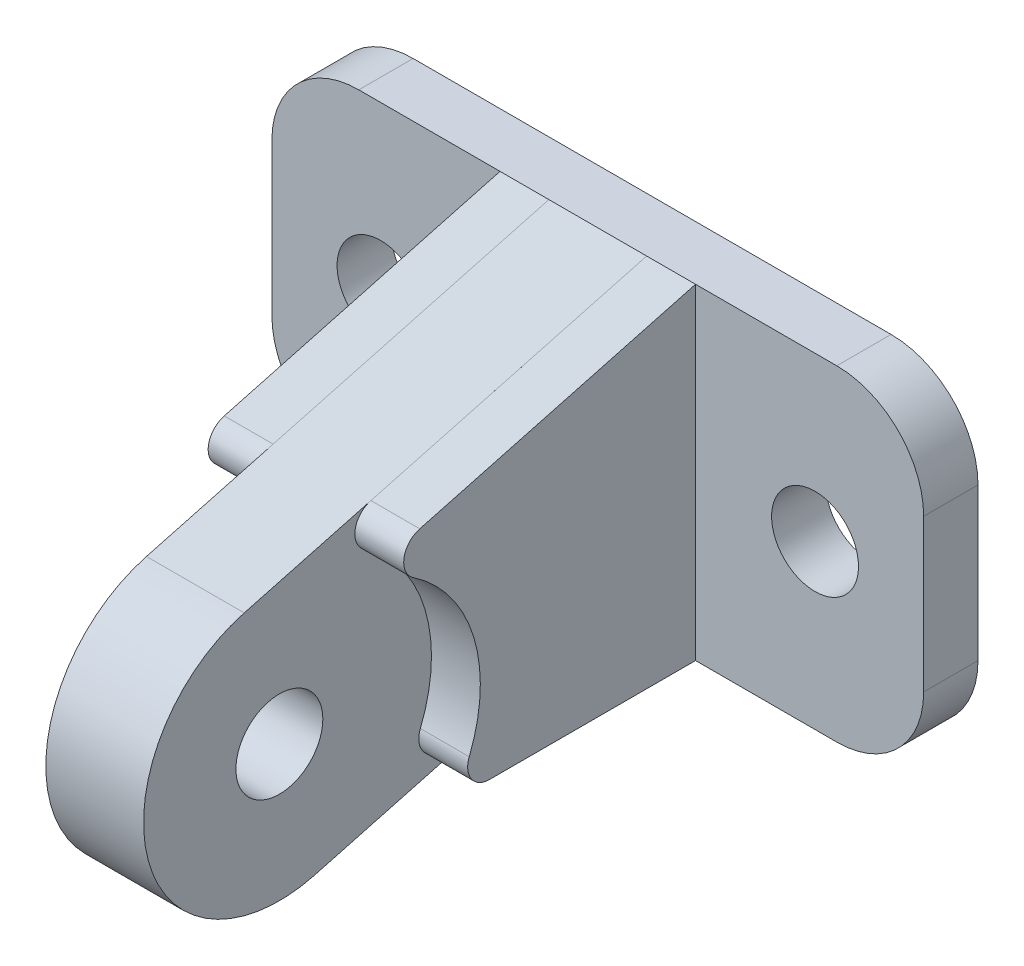
ISO-10303-21;
HEADER;
FILE_DESCRIPTION(('STEP AP214'),'2;1');
FILE_NAME('part.step','',(''),(''),'','','');
FILE_SCHEMA(('AUTOMOTIVE_DESIGN { 1 0 10303 214 1 1 1 1 }'));
ENDSEC;
DATA;
#1=APPLICATION_CONTEXT('core data for automotive mechanical design processes');
#2=APPLICATION_PROTOCOL_DEFINITION('international standard','automotive_design',2000,#1);
#3=PRODUCT_CONTEXT('',#1,'mechanical');
#4=PRODUCT('Part','Part','',(#3));
#5=PRODUCT_RELATED_PRODUCT_CATEGORY('part','',(#4));
#6=PRODUCT_DEFINITION_FORMATION('','',#4);
#7=PRODUCT_DEFINITION_CONTEXT('part definition',#1,'design');
#8=PRODUCT_DEFINITION('design','',#6,#7);
#9=PRODUCT_DEFINITION_SHAPE('','',#8);
#10=(LENGTH_UNIT() NAMED_UNIT(*) SI_UNIT(.MILLI.,.METRE.));
#11=(NAMED_UNIT(*) PLANE_ANGLE_UNIT() SI_UNIT($,.RADIAN.));
#12=(NAMED_UNIT(*) SI_UNIT($,.STERADIAN.) SOLID_ANGLE_UNIT());
#13=UNCERTAINTY_MEASURE_WITH_UNIT(LENGTH_MEASURE(1.E-05),#10,'distance_accuracy_value','');
#14=(GEOMETRIC_REPRESENTATION_CONTEXT(3) GLOBAL_UNCERTAINTY_ASSIGNED_CONTEXT((#13)) GLOBAL_UNIT_ASSIGNED_CONTEXT((#10,
#11,#12)) REPRESENTATION_CONTEXT('',''));
#15=CARTESIAN_POINT('',(0.,0.,0.));
#16=DIRECTION('',(0.,0.,1.));
#17=DIRECTION('',(1.,0.,0.));
#18=AXIS2_PLACEMENT_3D('',#15,#16,#17);
#19=CARTESIAN_POINT('',(0.,-15.,5.));
#20=DIRECTION('',(0.,1.,0.));
#21=DIRECTION('',(0.,0.,1.));
#22=AXIS2_PLACEMENT_3D('',#19,#20,#21);
#23=PLANE('',#22);
#24=DIRECTION('',(0.,0.,1.));
#25=VECTOR('',#24,1.);
#26=CARTESIAN_POINT('',(4.5,-15.,0.));
#27=LINE('',#26,#25);
#28=CARTESIAN_POINT('',(4.5,-15.,20.3718743059186));
#29=VERTEX_POINT('',#28);
#30=CARTESIAN_POINT('',(4.5,-15.,23.9793621856294));
#31=VERTEX_POINT('',#30);
#32=EDGE_CURVE('E442',#29,#31,#27,.T.);
#33=ORIENTED_EDGE('',*,*,#32,.F.);
#34=DIRECTION('',(1.,0.,0.));
#35=VECTOR('',#34,1.);
#36=CARTESIAN_POINT('',(-4.5,-15.,20.3718743059186));
#37=LINE('',#36,#35);
#38=CARTESIAN_POINT('',(-4.5,-15.,20.3718743059186));
#39=VERTEX_POINT('',#38);
#40=EDGE_CURVE('E412',#39,#29,#37,.T.);
#41=ORIENTED_EDGE('',*,*,#40,.F.);
#42=DIRECTION('',(0.,0.,1.));
#43=VECTOR('',#42,1.);
#44=CARTESIAN_POINT('',(-4.5,-15.,0.));
#45=LINE('',#44,#43);
#46=CARTESIAN_POINT('',(-4.5,-15.,23.9793621856294));
#47=VERTEX_POINT('',#46);
#48=EDGE_CURVE('E360',#39,#47,#45,.T.);
#49=ORIENTED_EDGE('',*,*,#48,.T.);
#50=DIRECTION('',(1.,0.,0.));
#51=VECTOR('',#50,1.);
#52=CARTESIAN_POINT('',(-9.,-15.,23.9793621856294));
#53=LINE('',#52,#51);
#54=CARTESIAN_POINT('',(-9.,-15.,23.9793621856294));
#55=VERTEX_POINT('',#54);
#56=EDGE_CURVE('E303',#55,#47,#53,.T.);
#57=ORIENTED_EDGE('',*,*,#56,.F.);
#58=DIRECTION('',(0.,0.,1.));
#59=VECTOR('',#58,1.);
#60=CARTESIAN_POINT('',(-9.,-15.,0.));
#61=LINE('',#60,#59);
#62=CARTESIAN_POINT('',(-9.,-15.,5.));
#63=VERTEX_POINT('',#62);
#64=EDGE_CURVE('E343',#63,#55,#61,.T.);
#65=ORIENTED_EDGE('',*,*,#64,.F.);
#66=DIRECTION('',(1.,0.,0.));
#67=VECTOR('',#66,1.);
#68=CARTESIAN_POINT('',(0.,-15.,5.));
#69=LINE('',#68,#67);
#70=CARTESIAN_POINT('',(-21.9999999999999,-15.,5.));
#71=VERTEX_POINT('',#70);
#72=EDGE_CURVE('E231',#71,#63,#69,.T.);
#73=ORIENTED_EDGE('',*,*,#72,.F.);
#74=DIRECTION('',(0.,0.,-1.));
#75=VECTOR('',#74,1.);
#76=CARTESIAN_POINT('',(-21.9999999999999,-15.,5.));
#77=LINE('',#76,#75);
#78=CARTESIAN_POINT('',(-21.9999999999999,-15.,0.));
#79=VERTEX_POINT('',#78);
#80=EDGE_CURVE('E294',#71,#79,#77,.T.);
#81=ORIENTED_EDGE('',*,*,#80,.T.);
#82=DIRECTION('',(1.,0.,0.));
#83=VECTOR('',#82,1.);
#84=CARTESIAN_POINT('',(0.,-15.,0.));
#85=LINE('',#84,#83);
#86=CARTESIAN_POINT('',(21.9999999999999,-15.,0.));
#87=VERTEX_POINT('',#86);
#88=EDGE_CURVE('E264',#79,#87,#85,.T.);
#89=ORIENTED_EDGE('',*,*,#88,.T.);
#90=DIRECTION('',(0.,0.,-1.));
#91=VECTOR('',#90,1.);
#92=CARTESIAN_POINT('',(21.9999999999999,-15.,5.));
#93=LINE('',#92,#91);
#94=CARTESIAN_POINT('',(21.9999999999999,-15.,5.));
#95=VERTEX_POINT('',#94);
#96=EDGE_CURVE('E292',#95,#87,#93,.T.);
#97=ORIENTED_EDGE('',*,*,#96,.F.);
#98=CARTESIAN_POINT('',(9.,-15.,5.));
#99=VERTEX_POINT('',#98);
#100=EDGE_CURVE('E234',#99,#95,#69,.T.);
#101=ORIENTED_EDGE('',*,*,#100,.F.);
#102=DIRECTION('',(0.,0.,1.));
#103=VECTOR('',#102,1.);
#104=CARTESIAN_POINT('',(9.,-15.,0.));
#105=LINE('',#104,#103);
#106=CARTESIAN_POINT('',(9.,-15.,23.9793621856294));
#107=VERTEX_POINT('',#106);
#108=EDGE_CURVE('E327',#99,#107,#105,.T.);
#109=ORIENTED_EDGE('',*,*,#108,.T.);
#110=EDGE_CURVE('E301',#31,#107,#53,.T.);
#111=ORIENTED_EDGE('',*,*,#110,.F.);
#112=EDGE_LOOP('',(#33,#41,#49,#57,#65,#73,#81,#89,#97,#101,#109,#111));
#113=FACE_BOUND('',#112,.T.);
#114=ADVANCED_FACE('F41',(#113),#23,.F.);
#115=CARTESIAN_POINT('',(-9.,6.26630262212569,29.8671957418454));
#116=DIRECTION('',(1.,0.,0.));
#117=DIRECTION('',(0.,0.,-1.));
#118=AXIS2_PLACEMENT_3D('',#115,#116,#117);
#119=CYLINDRICAL_SURFACE('',#118,2.);
#120=CARTESIAN_POINT('',(-4.5,6.26630262212569,29.8671957418454));
#121=DIRECTION('',(1.,0.,0.));
#122=DIRECTION('',(0.,0.,-1.));
#123=AXIS2_PLACEMENT_3D('',#120,#121,#122);
#124=CIRCLE('',#123,2.);
#125=CARTESIAN_POINT('',(-4.5,4.60801479435999,30.9852661690923));
#126=VERTEX_POINT('',#125);
#127=CARTESIAN_POINT('',(-4.5,8.19815427470383,30.3848338320504));
#128=VERTEX_POINT('',#127);
#129=EDGE_CURVE('E370',#126,#128,#124,.F.);
#130=ORIENTED_EDGE('',*,*,#129,.T.);
#131=DIRECTION('',(1.,0.,0.));
#132=VECTOR('',#131,1.);
#133=CARTESIAN_POINT('',(-9.,8.19815427470383,30.3848338320504));
#134=LINE('',#133,#132);
#135=CARTESIAN_POINT('',(-9.,8.19815427470383,30.3848338320504));
#136=VERTEX_POINT('',#135);
#137=EDGE_CURVE('E259',#136,#128,#134,.T.);
#138=ORIENTED_EDGE('',*,*,#137,.F.);
#139=CARTESIAN_POINT('',(-9.,6.26630262212569,29.8671957418454));
#140=DIRECTION('',(1.,0.,0.));
#141=DIRECTION('',(0.,0.,-1.));
#142=AXIS2_PLACEMENT_3D('',#139,#140,#141);
#143=CIRCLE('',#142,2.);
#144=CARTESIAN_POINT('',(-9.,4.60801479435999,30.9852661690923));
#145=VERTEX_POINT('',#144);
#146=EDGE_CURVE('E340',#145,#136,#143,.F.);
#147=ORIENTED_EDGE('',*,*,#146,.F.);
#148=DIRECTION('',(1.,0.,0.));
#149=VECTOR('',#148,1.);
#150=CARTESIAN_POINT('',(-9.,4.60801479435999,30.9852661690923));
#151=LINE('',#150,#149);
#152=EDGE_CURVE('E215',#145,#126,#151,.T.);
#153=ORIENTED_EDGE('',*,*,#152,.T.);
#154=EDGE_LOOP('',(#130,#138,#147,#153));
#155=FACE_BOUND('',#154,.T.);
#156=ADVANCED_FACE('F368',(#155),#119,.T.);
#157=CARTESIAN_POINT('',(-9.,15.2451905283833,4.08493649053891));
#158=DIRECTION('',(0.,0.965925826289068,0.258819045102521));
#159=DIRECTION('',(0.,-0.258819045102521,0.965925826289068));
#160=AXIS2_PLACEMENT_3D('',#157,#158,#159);
#161=PLANE('',#160);
#162=DIRECTION('',(0.,-0.258819045102521,0.965925826289068));
#163=VECTOR('',#162,1.);
#164=CARTESIAN_POINT('',(4.5,15.2451905283833,4.08493649053891));
#165=LINE('',#164,#163);
#166=CARTESIAN_POINT('',(4.5,15.,5.));
#167=VERTEX_POINT('',#166);
#168=CARTESIAN_POINT('',(4.5,8.19815427470383,30.3848338320504));
#169=VERTEX_POINT('',#168);
#170=EDGE_CURVE('E206',#167,#169,#165,.T.);
#171=ORIENTED_EDGE('',*,*,#170,.T.);
#172=CARTESIAN_POINT('',(9.,8.19815427470383,30.3848338320504));
#173=VERTEX_POINT('',#172);
#174=EDGE_CURVE('E202',#169,#173,#134,.T.);
#175=ORIENTED_EDGE('',*,*,#174,.T.);
#176=DIRECTION('',(0.,-0.258819045102521,0.965925826289068));
#177=VECTOR('',#176,1.);
#178=CARTESIAN_POINT('',(9.,15.2451905283833,4.08493649053891));
#179=LINE('',#178,#177);
#180=CARTESIAN_POINT('',(9.,15.,5.));
#181=VERTEX_POINT('',#180);
#182=EDGE_CURVE('E333',#181,#173,#179,.T.);
#183=ORIENTED_EDGE('',*,*,#182,.F.);
#184=DIRECTION('',(1.,0.,0.));
#185=VECTOR('',#184,1.);
#186=CARTESIAN_POINT('',(-9.,15.,5.));
#187=LINE('',#186,#185);
#188=EDGE_CURVE('E44',#167,#181,#187,.T.);
#189=ORIENTED_EDGE('',*,*,#188,.F.);
#190=EDGE_LOOP('',(#171,#175,#183,#189));
#191=FACE_BOUND('',#190,.T.);
#192=ADVANCED_FACE('F472',(#191),#161,.T.);
#193=ORIENTED_EDGE('',*,*,#137,.T.);
#194=DIRECTION('',(0.,-0.258819045102521,0.965925826289068));
#195=VECTOR('',#194,1.);
#196=CARTESIAN_POINT('',(-4.5,15.2451905283833,4.08493649053891));
#197=LINE('',#196,#195);
#198=CARTESIAN_POINT('',(-4.5,15.,5.));
#199=VERTEX_POINT('',#198);
#200=EDGE_CURVE('E375',#199,#128,#197,.T.);
#201=ORIENTED_EDGE('',*,*,#200,.F.);
#202=CARTESIAN_POINT('',(-9.,15.,5.));
#203=VERTEX_POINT('',#202);
#204=EDGE_CURVE('E300',#203,#199,#187,.T.);
#205=ORIENTED_EDGE('',*,*,#204,.F.);
#206=DIRECTION('',(0.,-0.258819045102521,0.965925826289068));
#207=VECTOR('',#206,1.);
#208=CARTESIAN_POINT('',(-9.,15.2451905283833,4.08493649053891));
#209=LINE('',#208,#207);
#210=EDGE_CURVE('E213',#203,#136,#209,.T.);
#211=ORIENTED_EDGE('',*,*,#210,.T.);
#212=EDGE_LOOP('',(#193,#201,#205,#211));
#213=FACE_BOUND('',#212,.T.);
#214=ADVANCED_FACE('F371',(#213),#161,.T.);
#215=CARTESIAN_POINT('',(-9.,-13.,23.9793621856294));
#216=DIRECTION('',(1.,0.,0.));
#217=DIRECTION('',(0.,0.,-1.));
#218=AXIS2_PLACEMENT_3D('',#215,#216,#217);
#219=CYLINDRICAL_SURFACE('',#218,2.);
#220=CARTESIAN_POINT('',(-4.5,-13.,23.9793621856294));
#221=DIRECTION('',(1.,0.,0.));
#222=DIRECTION('',(0.,0.,-1.));
#223=AXIS2_PLACEMENT_3D('',#220,#221,#222);
#224=CIRCLE('',#223,2.);
#225=CARTESIAN_POINT('',(-4.5,-12.25,25.8334118074033));
#226=VERTEX_POINT('',#225);
#227=EDGE_CURVE('E425',#47,#226,#224,.F.);
#228=ORIENTED_EDGE('',*,*,#227,.T.);
#229=DIRECTION('',(1.,0.,0.));
#230=VECTOR('',#229,1.);
#231=CARTESIAN_POINT('',(-9.,-12.25,25.8334118074033));
#232=LINE('',#231,#230);
#233=CARTESIAN_POINT('',(-9.,-12.25,25.8334118074033));
#234=VERTEX_POINT('',#233);
#235=EDGE_CURVE('E225',#234,#226,#232,.T.);
#236=ORIENTED_EDGE('',*,*,#235,.F.);
#237=CARTESIAN_POINT('',(-9.,-13.,23.9793621856294));
#238=DIRECTION('',(1.,0.,0.));
#239=DIRECTION('',(0.,0.,-1.));
#240=AXIS2_PLACEMENT_3D('',#237,#238,#239);
#241=CIRCLE('',#240,2.);
#242=EDGE_CURVE('E342',#55,#234,#241,.F.);
#243=ORIENTED_EDGE('',*,*,#242,.F.);
#244=ORIENTED_EDGE('',*,*,#56,.T.);
#245=EDGE_LOOP('',(#228,#236,#243,#244));
#246=FACE_BOUND('',#245,.T.);
#247=ADVANCED_FACE('F358',(#246),#219,.T.);
#248=CARTESIAN_POINT('',(-9.,-6.99999999999994,38.8117591598207));
#249=DIRECTION('',(1.,0.,0.));
#250=DIRECTION('',(0.,0.,-1.));
#251=AXIS2_PLACEMENT_3D('',#248,#249,#250);
#252=CYLINDRICAL_SURFACE('',#251,14.);
#253=CARTESIAN_POINT('',(-4.5,-6.99999999999994,38.8117591598207));
#254=DIRECTION('',(1.,0.,0.));
#255=DIRECTION('',(0.,0.,-1.));
#256=AXIS2_PLACEMENT_3D('',#253,#254,#255);
#257=CIRCLE('',#256,14.);
#258=EDGE_CURVE('E361',#226,#126,#257,.T.);
#259=ORIENTED_EDGE('',*,*,#258,.T.);
#260=ORIENTED_EDGE('',*,*,#152,.F.);
#261=CARTESIAN_POINT('',(-9.,-6.99999999999994,38.8117591598207));
#262=DIRECTION('',(1.,0.,0.));
#263=DIRECTION('',(0.,0.,-1.));
#264=AXIS2_PLACEMENT_3D('',#261,#262,#263);
#265=CIRCLE('',#264,14.);
#266=EDGE_CURVE('E336',#234,#145,#265,.T.);
#267=ORIENTED_EDGE('',*,*,#266,.F.);
#268=ORIENTED_EDGE('',*,*,#235,.T.);
#269=EDGE_LOOP('',(#259,#260,#267,#268));
#270=FACE_BOUND('',#269,.T.);
#271=ADVANCED_FACE('F362',(#270),#252,.F.);
#272=CARTESIAN_POINT('',(0.,0.,5.));
#273=DIRECTION('',(0.,0.,1.));
#274=DIRECTION('',(1.,0.,0.));
#275=AXIS2_PLACEMENT_3D('',#272,#273,#274);
#276=PLANE('',#275);
#277=CARTESIAN_POINT('',(20.,0.,5.));
#278=DIRECTION('',(0.,0.,1.));
#279=DIRECTION('',(1.,0.,0.));
#280=AXIS2_PLACEMENT_3D('',#277,#278,#279);
#281=CIRCLE('',#280,4.);
#282=CARTESIAN_POINT('',(24.,0.,5.));
#283=VERTEX_POINT('',#282);
#284=EDGE_CURVE('E253',#283,#283,#281,.F.);
#285=ORIENTED_EDGE('',*,*,#284,.T.);
#286=EDGE_LOOP('',(#285));
#287=FACE_BOUND('',#286,.T.);
#288=DIRECTION('',(1.,0.,0.));
#289=VECTOR('',#288,1.);
#290=CARTESIAN_POINT('',(0.,15.,5.));
#291=LINE('',#290,#289);
#292=CARTESIAN_POINT('',(21.9999999999999,15.,5.));
#293=VERTEX_POINT('',#292);
#294=EDGE_CURVE('E241',#181,#293,#291,.T.);
#295=ORIENTED_EDGE('',*,*,#294,.F.);
#296=DIRECTION('',(0.,-1.,0.));
#297=VECTOR('',#296,1.);
#298=CARTESIAN_POINT('',(9.,0.,5.));
#299=LINE('',#298,#297);
#300=EDGE_CURVE('E329',#181,#99,#299,.T.);
#301=ORIENTED_EDGE('',*,*,#300,.T.);
#302=ORIENTED_EDGE('',*,*,#100,.T.);
#303=CARTESIAN_POINT('',(22.,-7.,5.));
#304=DIRECTION('',(0.,0.,1.));
#305=DIRECTION('',(1.,0.,0.));
#306=AXIS2_PLACEMENT_3D('',#303,#304,#305);
#307=CIRCLE('',#306,8.);
#308=CARTESIAN_POINT('',(30.,-6.99999999999994,5.));
#309=VERTEX_POINT('',#308);
#310=EDGE_CURVE('E240',#95,#309,#307,.T.);
#311=ORIENTED_EDGE('',*,*,#310,.T.);
#312=DIRECTION('',(0.,1.,0.));
#313=VECTOR('',#312,1.);
#314=CARTESIAN_POINT('',(30.,0.,5.));
#315=LINE('',#314,#313);
#316=CARTESIAN_POINT('',(30.,6.99999999999994,5.));
#317=VERTEX_POINT('',#316);
#318=EDGE_CURVE('E239',#309,#317,#315,.T.);
#319=ORIENTED_EDGE('',*,*,#318,.T.);
#320=CARTESIAN_POINT('',(22.,7.,5.));
#321=DIRECTION('',(0.,0.,1.));
#322=DIRECTION('',(1.,0.,0.));
#323=AXIS2_PLACEMENT_3D('',#320,#321,#322);
#324=CIRCLE('',#323,8.);
#325=EDGE_CURVE('E242',#293,#317,#324,.F.);
#326=ORIENTED_EDGE('',*,*,#325,.F.);
#327=EDGE_LOOP('',(#295,#301,#302,#311,#319,#326));
#328=FACE_BOUND('',#327,.T.);
#329=ADVANCED_FACE('F407',(#287,#328),#276,.T.);
#330=CARTESIAN_POINT('',(-22.,7.,5.));
#331=DIRECTION('',(0.,0.,-1.));
#332=DIRECTION('',(-1.,0.,0.));
#333=AXIS2_PLACEMENT_3D('',#330,#331,#332);
#334=CYLINDRICAL_SURFACE('',#333,8.);
#335=CARTESIAN_POINT('',(-22.,7.,0.));
#336=DIRECTION('',(0.,0.,1.));
#337=DIRECTION('',(1.,0.,0.));
#338=AXIS2_PLACEMENT_3D('',#335,#336,#337);
#339=CIRCLE('',#338,8.);
#340=CARTESIAN_POINT('',(-30.,6.99999999999994,0.));
#341=VERTEX_POINT('',#340);
#342=CARTESIAN_POINT('',(-21.9999999999999,15.,0.));
#343=VERTEX_POINT('',#342);
#344=EDGE_CURVE('E254',#341,#343,#339,.F.);
#345=ORIENTED_EDGE('',*,*,#344,.F.);
#346=DIRECTION('',(0.,0.,-1.));
#347=VECTOR('',#346,1.);
#348=CARTESIAN_POINT('',(-30.,6.99999999999994,5.));
#349=LINE('',#348,#347);
#350=CARTESIAN_POINT('',(-30.,6.99999999999994,5.));
#351=VERTEX_POINT('',#350);
#352=EDGE_CURVE('E11',#351,#341,#349,.T.);
#353=ORIENTED_EDGE('',*,*,#352,.F.);
#354=CARTESIAN_POINT('',(-22.,7.,5.));
#355=DIRECTION('',(0.,0.,1.));
#356=DIRECTION('',(1.,0.,0.));
#357=AXIS2_PLACEMENT_3D('',#354,#355,#356);
#358=CIRCLE('',#357,8.);
#359=CARTESIAN_POINT('',(-21.9999999999999,15.,5.));
#360=VERTEX_POINT('',#359);
#361=EDGE_CURVE('E221',#351,#360,#358,.F.);
#362=ORIENTED_EDGE('',*,*,#361,.T.);
#363=DIRECTION('',(0.,0.,-1.));
#364=VECTOR('',#363,1.);
#365=CARTESIAN_POINT('',(-21.9999999999999,15.,5.));
#366=LINE('',#365,#364);
#367=EDGE_CURVE('E255',#360,#343,#366,.T.);
#368=ORIENTED_EDGE('',*,*,#367,.T.);
#369=EDGE_LOOP('',(#345,#353,#362,#368));
#370=FACE_BOUND('',#369,.T.);
#371=ADVANCED_FACE('F43',(#370),#334,.T.);
#372=CARTESIAN_POINT('',(-30.,0.,5.));
#373=DIRECTION('',(-1.,0.,0.));
#374=DIRECTION('',(0.,0.,1.));
#375=AXIS2_PLACEMENT_3D('',#372,#373,#374);
#376=PLANE('',#375);
#377=DIRECTION('',(0.,1.,0.));
#378=VECTOR('',#377,1.);
#379=CARTESIAN_POINT('',(-30.,0.,0.));
#380=LINE('',#379,#378);
#381=CARTESIAN_POINT('',(-30.,-6.99999999999994,0.));
#382=VERTEX_POINT('',#381);
#383=EDGE_CURVE('E256',#382,#341,#380,.T.);
#384=ORIENTED_EDGE('',*,*,#383,.F.);
#385=DIRECTION('',(0.,0.,-1.));
#386=VECTOR('',#385,1.);
#387=CARTESIAN_POINT('',(-30.,-6.99999999999994,5.));
#388=LINE('',#387,#386);
#389=CARTESIAN_POINT('',(-30.,-6.99999999999994,5.));
#390=VERTEX_POINT('',#389);
#391=EDGE_CURVE('E51',#390,#382,#388,.T.);
#392=ORIENTED_EDGE('',*,*,#391,.F.);
#393=DIRECTION('',(0.,1.,0.));
#394=VECTOR('',#393,1.);
#395=CARTESIAN_POINT('',(-30.,0.,5.));
#396=LINE('',#395,#394);
#397=EDGE_CURVE('E230',#390,#351,#396,.T.);
#398=ORIENTED_EDGE('',*,*,#397,.T.);
#399=ORIENTED_EDGE('',*,*,#352,.T.);
#400=EDGE_LOOP('',(#384,#392,#398,#399));
#401=FACE_BOUND('',#400,.T.);
#402=ADVANCED_FACE('F383',(#401),#376,.T.);
#403=CARTESIAN_POINT('',(-22.,-7.,5.));
#404=DIRECTION('',(0.,0.,-1.));
#405=DIRECTION('',(-1.,0.,0.));
#406=AXIS2_PLACEMENT_3D('',#403,#404,#405);
#407=CYLINDRICAL_SURFACE('',#406,8.);
#408=CARTESIAN_POINT('',(-22.,-7.,0.));
#409=DIRECTION('',(0.,0.,1.));
#410=DIRECTION('',(1.,0.,0.));
#411=AXIS2_PLACEMENT_3D('',#408,#409,#410);
#412=CIRCLE('',#411,8.);
#413=EDGE_CURVE('E265',#79,#382,#412,.F.);
#414=ORIENTED_EDGE('',*,*,#413,.F.);
#415=ORIENTED_EDGE('',*,*,#80,.F.);
#416=CARTESIAN_POINT('',(-22.,-7.,5.));
#417=DIRECTION('',(0.,0.,1.));
#418=DIRECTION('',(1.,0.,0.));
#419=AXIS2_PLACEMENT_3D('',#416,#417,#418);
#420=CIRCLE('',#419,8.);
#421=EDGE_CURVE('E232',#71,#390,#420,.F.);
#422=ORIENTED_EDGE('',*,*,#421,.T.);
#423=ORIENTED_EDGE('',*,*,#391,.T.);
#424=EDGE_LOOP('',(#414,#415,#422,#423));
#425=FACE_BOUND('',#424,.T.);
#426=ADVANCED_FACE('F389',(#425),#407,.T.);
#427=CARTESIAN_POINT('',(22.,-7.,5.));
#428=DIRECTION('',(0.,0.,-1.));
#429=DIRECTION('',(-1.,0.,0.));
#430=AXIS2_PLACEMENT_3D('',#427,#428,#429);
#431=CYLINDRICAL_SURFACE('',#430,8.);
#432=CARTESIAN_POINT('',(22.,-7.,0.));
#433=DIRECTION('',(0.,0.,1.));
#434=DIRECTION('',(1.,0.,0.));
#435=AXIS2_PLACEMENT_3D('',#432,#433,#434);
#436=CIRCLE('',#435,8.);
#437=CARTESIAN_POINT('',(30.,-6.99999999999994,0.));
#438=VERTEX_POINT('',#437);
#439=EDGE_CURVE('E270',#87,#438,#436,.T.);
#440=ORIENTED_EDGE('',*,*,#439,.T.);
#441=DIRECTION('',(0.,0.,-1.));
#442=VECTOR('',#441,1.);
#443=CARTESIAN_POINT('',(30.,-6.99999999999994,5.));
#444=LINE('',#443,#442);
#445=EDGE_CURVE('E288',#309,#438,#444,.T.);
#446=ORIENTED_EDGE('',*,*,#445,.F.);
#447=ORIENTED_EDGE('',*,*,#310,.F.);
#448=ORIENTED_EDGE('',*,*,#96,.T.);
#449=EDGE_LOOP('',(#440,#446,#447,#448));
#450=FACE_BOUND('',#449,.T.);
#451=ADVANCED_FACE('F398',(#450),#431,.T.);
#452=CARTESIAN_POINT('',(30.,0.,5.));
#453=DIRECTION('',(-1.,0.,0.));
#454=DIRECTION('',(0.,0.,1.));
#455=AXIS2_PLACEMENT_3D('',#452,#453,#454);
#456=PLANE('',#455);
#457=DIRECTION('',(0.,1.,0.));
#458=VECTOR('',#457,1.);
#459=CARTESIAN_POINT('',(30.,0.,0.));
#460=LINE('',#459,#458);
#461=CARTESIAN_POINT('',(30.,6.99999999999994,0.));
#462=VERTEX_POINT('',#461);
#463=EDGE_CURVE('E267',#438,#462,#460,.T.);
#464=ORIENTED_EDGE('',*,*,#463,.T.);
#465=DIRECTION('',(0.,0.,-1.));
#466=VECTOR('',#465,1.);
#467=CARTESIAN_POINT('',(30.,6.99999999999994,5.));
#468=LINE('',#467,#466);
#469=EDGE_CURVE('E287',#317,#462,#468,.T.);
#470=ORIENTED_EDGE('',*,*,#469,.F.);
#471=ORIENTED_EDGE('',*,*,#318,.F.);
#472=ORIENTED_EDGE('',*,*,#445,.T.);
#473=EDGE_LOOP('',(#464,#470,#471,#472));
#474=FACE_BOUND('',#473,.T.);
#475=ADVANCED_FACE('F405',(#474),#456,.F.);
#476=CARTESIAN_POINT('',(22.,7.,5.));
#477=DIRECTION('',(0.,0.,-1.));
#478=DIRECTION('',(-1.,0.,0.));
#479=AXIS2_PLACEMENT_3D('',#476,#477,#478);
#480=CYLINDRICAL_SURFACE('',#479,8.);
#481=CARTESIAN_POINT('',(22.,7.,0.));
#482=DIRECTION('',(0.,0.,1.));
#483=DIRECTION('',(1.,0.,0.));
#484=AXIS2_PLACEMENT_3D('',#481,#482,#483);
#485=CIRCLE('',#484,8.);
#486=CARTESIAN_POINT('',(21.9999999999999,15.,0.));
#487=VERTEX_POINT('',#486);
#488=EDGE_CURVE('E275',#487,#462,#485,.F.);
#489=ORIENTED_EDGE('',*,*,#488,.F.);
#490=DIRECTION('',(0.,0.,-1.));
#491=VECTOR('',#490,1.);
#492=CARTESIAN_POINT('',(21.9999999999999,15.,5.));
#493=LINE('',#492,#491);
#494=EDGE_CURVE('E281',#293,#487,#493,.T.);
#495=ORIENTED_EDGE('',*,*,#494,.F.);
#496=ORIENTED_EDGE('',*,*,#325,.T.);
#497=ORIENTED_EDGE('',*,*,#469,.T.);
#498=EDGE_LOOP('',(#489,#495,#496,#497));
#499=FACE_BOUND('',#498,.T.);
#500=ADVANCED_FACE('F489',(#499),#480,.T.);
#501=CARTESIAN_POINT('',(-20.,0.,5.));
#502=DIRECTION('',(0.,0.,-1.));
#503=DIRECTION('',(-1.,0.,0.));
#504=AXIS2_PLACEMENT_3D('',#501,#502,#503);
#505=CYLINDRICAL_SURFACE('',#504,4.);
#506=CARTESIAN_POINT('',(-20.,0.,5.));
#507=DIRECTION('',(0.,0.,1.));
#508=DIRECTION('',(1.,0.,0.));
#509=AXIS2_PLACEMENT_3D('',#506,#507,#508);
#510=CIRCLE('',#509,4.);
#511=CARTESIAN_POINT('',(-16.,0.,5.));
#512=VERTEX_POINT('',#511);
#513=EDGE_CURVE('E248',#512,#512,#510,.T.);
#514=ORIENTED_EDGE('',*,*,#513,.T.);
#515=EDGE_LOOP('',(#514));
#516=FACE_BOUND('',#515,.T.);
#517=CARTESIAN_POINT('',(-20.,0.,0.));
#518=DIRECTION('',(0.,0.,1.));
#519=DIRECTION('',(1.,0.,0.));
#520=AXIS2_PLACEMENT_3D('',#517,#518,#519);
#521=CIRCLE('',#520,4.);
#522=CARTESIAN_POINT('',(-16.,0.,0.));
#523=VERTEX_POINT('',#522);
#524=EDGE_CURVE('E279',#523,#523,#521,.T.);
#525=ORIENTED_EDGE('',*,*,#524,.F.);
#526=EDGE_LOOP('',(#525));
#527=FACE_BOUND('',#526,.T.);
#528=ADVANCED_FACE('F495',(#516,#527),#505,.F.);
#529=CARTESIAN_POINT('',(0.,15.,5.));
#530=DIRECTION('',(0.,1.,0.));
#531=DIRECTION('',(0.,0.,1.));
#532=AXIS2_PLACEMENT_3D('',#529,#530,#531);
#533=PLANE('',#532);
#534=DIRECTION('',(1.,0.,0.));
#535=VECTOR('',#534,1.);
#536=CARTESIAN_POINT('',(0.,15.,0.));
#537=LINE('',#536,#535);
#538=EDGE_CURVE('E274',#343,#487,#537,.T.);
#539=ORIENTED_EDGE('',*,*,#538,.F.);
#540=ORIENTED_EDGE('',*,*,#367,.F.);
#541=EDGE_CURVE('E243',#360,#203,#291,.T.);
#542=ORIENTED_EDGE('',*,*,#541,.T.);
#543=ORIENTED_EDGE('',*,*,#204,.T.);
#544=DIRECTION('',(1.,0.,0.));
#545=VECTOR('',#544,1.);
#546=CARTESIAN_POINT('',(-4.5,15.,5.));
#547=LINE('',#546,#545);
#548=EDGE_CURVE('E376',#199,#167,#547,.T.);
#549=ORIENTED_EDGE('',*,*,#548,.T.);
#550=ORIENTED_EDGE('',*,*,#188,.T.);
#551=ORIENTED_EDGE('',*,*,#294,.T.);
#552=ORIENTED_EDGE('',*,*,#494,.T.);
#553=EDGE_LOOP('',(#539,#540,#542,#543,#549,#550,#551,#552));
#554=FACE_BOUND('',#553,.T.);
#555=ADVANCED_FACE('F372',(#554),#533,.T.);
#556=CARTESIAN_POINT('',(20.,0.,5.));
#557=DIRECTION('',(0.,0.,-1.));
#558=DIRECTION('',(-1.,0.,0.));
#559=AXIS2_PLACEMENT_3D('',#556,#557,#558);
#560=CYLINDRICAL_SURFACE('',#559,4.);
#561=ORIENTED_EDGE('',*,*,#284,.F.);
#562=EDGE_LOOP('',(#561));
#563=FACE_BOUND('',#562,.T.);
#564=CARTESIAN_POINT('',(20.,0.,0.));
#565=DIRECTION('',(0.,0.,1.));
#566=DIRECTION('',(1.,0.,0.));
#567=AXIS2_PLACEMENT_3D('',#564,#565,#566);
#568=CIRCLE('',#567,4.);
#569=CARTESIAN_POINT('',(24.,0.,0.));
#570=VERTEX_POINT('',#569);
#571=EDGE_CURVE('E229',#570,#570,#568,.F.);
#572=ORIENTED_EDGE('',*,*,#571,.T.);
#573=EDGE_LOOP('',(#572));
#574=FACE_BOUND('',#573,.T.);
#575=ADVANCED_FACE('F505',(#563,#574),#560,.F.);
#576=DIRECTION('',(0.,-1.,0.));
#577=VECTOR('',#576,1.);
#578=CARTESIAN_POINT('',(-9.,0.,5.));
#579=LINE('',#578,#577);
#580=EDGE_CURVE('E217',#203,#63,#579,.T.);
#581=ORIENTED_EDGE('',*,*,#580,.F.);
#582=ORIENTED_EDGE('',*,*,#541,.F.);
#583=ORIENTED_EDGE('',*,*,#361,.F.);
#584=ORIENTED_EDGE('',*,*,#397,.F.);
#585=ORIENTED_EDGE('',*,*,#421,.F.);
#586=ORIENTED_EDGE('',*,*,#72,.T.);
#587=EDGE_LOOP('',(#581,#582,#583,#584,#585,#586));
#588=FACE_BOUND('',#587,.T.);
#589=ORIENTED_EDGE('',*,*,#513,.F.);
#590=EDGE_LOOP('',(#589));
#591=FACE_BOUND('',#590,.T.);
#592=ADVANCED_FACE('F378',(#588,#591),#276,.T.);
#593=CARTESIAN_POINT('',(0.,0.,0.));
#594=DIRECTION('',(0.,0.,1.));
#595=DIRECTION('',(1.,0.,0.));
#596=AXIS2_PLACEMENT_3D('',#593,#594,#595);
#597=PLANE('',#596);
#598=ORIENTED_EDGE('',*,*,#344,.T.);
#599=ORIENTED_EDGE('',*,*,#538,.T.);
#600=ORIENTED_EDGE('',*,*,#488,.T.);
#601=ORIENTED_EDGE('',*,*,#463,.F.);
#602=ORIENTED_EDGE('',*,*,#439,.F.);
#603=ORIENTED_EDGE('',*,*,#88,.F.);
#604=ORIENTED_EDGE('',*,*,#413,.T.);
#605=ORIENTED_EDGE('',*,*,#383,.T.);
#606=EDGE_LOOP('',(#598,#599,#600,#601,#602,#603,#604,#605));
#607=FACE_BOUND('',#606,.T.);
#608=ORIENTED_EDGE('',*,*,#524,.T.);
#609=EDGE_LOOP('',(#608));
#610=FACE_BOUND('',#609,.T.);
#611=ORIENTED_EDGE('',*,*,#571,.F.);
#612=EDGE_LOOP('',(#611));
#613=FACE_BOUND('',#612,.T.);
#614=ADVANCED_FACE('F394',(#607,#610,#613),#597,.F.);
#615=ORIENTED_EDGE('',*,*,#174,.F.);
#616=CARTESIAN_POINT('',(4.5,6.26630262212569,29.8671957418454));
#617=DIRECTION('',(1.,0.,0.));
#618=DIRECTION('',(0.,0.,-1.));
#619=AXIS2_PLACEMENT_3D('',#616,#617,#618);
#620=CIRCLE('',#619,2.);
#621=CARTESIAN_POINT('',(4.5,4.60801479435999,30.9852661690923));
#622=VERTEX_POINT('',#621);
#623=EDGE_CURVE('E195',#622,#169,#620,.F.);
#624=ORIENTED_EDGE('',*,*,#623,.F.);
#625=CARTESIAN_POINT('',(9.,4.60801479435999,30.9852661690923));
#626=VERTEX_POINT('',#625);
#627=EDGE_CURVE('E201',#622,#626,#151,.T.);
#628=ORIENTED_EDGE('',*,*,#627,.T.);
#629=CARTESIAN_POINT('',(9.,6.26630262212569,29.8671957418454));
#630=DIRECTION('',(1.,0.,0.));
#631=DIRECTION('',(0.,0.,-1.));
#632=AXIS2_PLACEMENT_3D('',#629,#630,#631);
#633=CIRCLE('',#632,2.);
#634=EDGE_CURVE('E324',#626,#173,#633,.F.);
#635=ORIENTED_EDGE('',*,*,#634,.T.);
#636=EDGE_LOOP('',(#615,#624,#628,#635));
#637=FACE_BOUND('',#636,.T.);
#638=ADVANCED_FACE('F203',(#637),#119,.T.);
#639=CARTESIAN_POINT('',(4.5,-12.25,25.8334118074033));
#640=VERTEX_POINT('',#639);
#641=CARTESIAN_POINT('',(9.,-12.25,25.8334118074033));
#642=VERTEX_POINT('',#641);
#643=EDGE_CURVE('E216',#640,#642,#232,.T.);
#644=ORIENTED_EDGE('',*,*,#643,.F.);
#645=CARTESIAN_POINT('',(4.5,-13.,23.9793621856294));
#646=DIRECTION('',(1.,0.,0.));
#647=DIRECTION('',(0.,0.,-1.));
#648=AXIS2_PLACEMENT_3D('',#645,#646,#647);
#649=CIRCLE('',#648,2.);
#650=EDGE_CURVE('E56',#31,#640,#649,.F.);
#651=ORIENTED_EDGE('',*,*,#650,.F.);
#652=ORIENTED_EDGE('',*,*,#110,.T.);
#653=CARTESIAN_POINT('',(9.,-13.,23.9793621856294));
#654=DIRECTION('',(1.,0.,0.));
#655=DIRECTION('',(0.,0.,-1.));
#656=AXIS2_PLACEMENT_3D('',#653,#654,#655);
#657=CIRCLE('',#656,2.);
#658=EDGE_CURVE('E325',#107,#642,#657,.F.);
#659=ORIENTED_EDGE('',*,*,#658,.T.);
#660=EDGE_LOOP('',(#644,#651,#652,#659));
#661=FACE_BOUND('',#660,.T.);
#662=ADVANCED_FACE('F330',(#661),#219,.T.);
#663=ORIENTED_EDGE('',*,*,#627,.F.);
#664=CARTESIAN_POINT('',(4.5,-6.99999999999994,38.8117591598207));
#665=DIRECTION('',(1.,0.,0.));
#666=DIRECTION('',(0.,0.,-1.));
#667=AXIS2_PLACEMENT_3D('',#664,#665,#666);
#668=CIRCLE('',#667,14.);
#669=EDGE_CURVE('E189',#640,#622,#668,.T.);
#670=ORIENTED_EDGE('',*,*,#669,.F.);
#671=ORIENTED_EDGE('',*,*,#643,.T.);
#672=CARTESIAN_POINT('',(9.,-6.99999999999994,38.8117591598207));
#673=DIRECTION('',(1.,0.,0.));
#674=DIRECTION('',(0.,0.,-1.));
#675=AXIS2_PLACEMENT_3D('',#672,#673,#674);
#676=CIRCLE('',#675,14.);
#677=EDGE_CURVE('E211',#642,#626,#676,.T.);
#678=ORIENTED_EDGE('',*,*,#677,.T.);
#679=EDGE_LOOP('',(#663,#670,#671,#678));
#680=FACE_BOUND('',#679,.T.);
#681=ADVANCED_FACE('F207',(#680),#252,.F.);
#682=CARTESIAN_POINT('',(-9.,0.,0.));
#683=DIRECTION('',(1.,0.,0.));
#684=DIRECTION('',(0.,0.,-1.));
#685=AXIS2_PLACEMENT_3D('',#682,#683,#684);
#686=PLANE('',#685);
#687=ORIENTED_EDGE('',*,*,#146,.T.);
#688=ORIENTED_EDGE('',*,*,#210,.F.);
#689=ORIENTED_EDGE('',*,*,#580,.T.);
#690=ORIENTED_EDGE('',*,*,#64,.T.);
#691=ORIENTED_EDGE('',*,*,#242,.T.);
#692=ORIENTED_EDGE('',*,*,#266,.T.);
#693=EDGE_LOOP('',(#687,#688,#689,#690,#691,#692));
#694=FACE_BOUND('',#693,.T.);
#695=ADVANCED_FACE('F346',(#694),#686,.F.);
#696=CARTESIAN_POINT('',(9.,0.,0.));
#697=DIRECTION('',(1.,0.,0.));
#698=DIRECTION('',(0.,0.,-1.));
#699=AXIS2_PLACEMENT_3D('',#696,#697,#698);
#700=PLANE('',#699);
#701=ORIENTED_EDGE('',*,*,#634,.F.);
#702=ORIENTED_EDGE('',*,*,#677,.F.);
#703=ORIENTED_EDGE('',*,*,#658,.F.);
#704=ORIENTED_EDGE('',*,*,#108,.F.);
#705=ORIENTED_EDGE('',*,*,#300,.F.);
#706=ORIENTED_EDGE('',*,*,#182,.T.);
#707=EDGE_LOOP('',(#701,#702,#703,#704,#705,#706));
#708=FACE_BOUND('',#707,.T.);
#709=ADVANCED_FACE('F319',(#708),#700,.T.);
#710=CARTESIAN_POINT('',(-4.5,-8.90222195190361,-2.3853431828552));
#711=DIRECTION('',(0.,-0.965925826289068,-0.258819045102522));
#712=DIRECTION('',(0.,0.258819045102522,-0.965925826289068));
#713=AXIS2_PLACEMENT_3D('',#710,#711,#712);
#714=PLANE('',#713);
#715=ORIENTED_EDGE('',*,*,#40,.T.);
#716=DIRECTION('',(0.,0.258819045102522,-0.965925826289068));
#717=VECTOR('',#716,1.);
#718=CARTESIAN_POINT('',(4.5,-8.90222195190361,-2.3853431828552));
#719=LINE('',#718,#717);
#720=CARTESIAN_POINT('',(4.5,-19.0740728286133,35.5765210960392));
#721=VERTEX_POINT('',#720);
#722=EDGE_CURVE('E444',#721,#29,#719,.T.);
#723=ORIENTED_EDGE('',*,*,#722,.F.);
#724=DIRECTION('',(1.,0.,0.));
#725=VECTOR('',#724,1.);
#726=CARTESIAN_POINT('',(-4.5,-19.0740728286133,35.5765210960392));
#727=LINE('',#726,#725);
#728=CARTESIAN_POINT('',(-4.5,-19.0740728286133,35.5765210960392));
#729=VERTEX_POINT('',#728);
#730=EDGE_CURVE('E415',#729,#721,#727,.T.);
#731=ORIENTED_EDGE('',*,*,#730,.F.);
#732=DIRECTION('',(0.,0.258819045102522,-0.965925826289068));
#733=VECTOR('',#732,1.);
#734=CARTESIAN_POINT('',(-4.5,-8.90222195190361,-2.3853431828552));
#735=LINE('',#734,#733);
#736=EDGE_CURVE('E426',#729,#39,#735,.T.);
#737=ORIENTED_EDGE('',*,*,#736,.T.);
#738=EDGE_LOOP('',(#715,#723,#731,#737));
#739=FACE_BOUND('',#738,.T.);
#740=ADVANCED_FACE('F518',(#739),#714,.T.);
#741=CARTESIAN_POINT('',(-4.5,-6.99999999999994,38.8117591598207));
#742=DIRECTION('',(1.,0.,0.));
#743=DIRECTION('',(0.,0.,-1.));
#744=AXIS2_PLACEMENT_3D('',#741,#742,#743);
#745=CYLINDRICAL_SURFACE('',#744,12.5);
#746=ORIENTED_EDGE('',*,*,#730,.T.);
#747=CARTESIAN_POINT('',(4.5,-6.99999999999994,38.8117591598207));
#748=DIRECTION('',(1.,0.,0.));
#749=DIRECTION('',(0.,0.,-1.));
#750=AXIS2_PLACEMENT_3D('',#747,#748,#749);
#751=CIRCLE('',#750,12.5);
#752=CARTESIAN_POINT('',(4.5,5.07413685362895,42.0467582695332));
#753=VERTEX_POINT('',#752);
#754=EDGE_CURVE('E447',#753,#721,#751,.T.);
#755=ORIENTED_EDGE('',*,*,#754,.F.);
#756=DIRECTION('',(1.,0.,0.));
#757=VECTOR('',#756,1.);
#758=CARTESIAN_POINT('',(-4.5,5.07413685362895,42.0467582695332));
#759=LINE('',#758,#757);
#760=CARTESIAN_POINT('',(-4.5,5.07413685362895,42.0467582695332));
#761=VERTEX_POINT('',#760);
#762=EDGE_CURVE('E417',#761,#753,#759,.T.);
#763=ORIENTED_EDGE('',*,*,#762,.F.);
#764=CARTESIAN_POINT('',(-4.5,-6.99999999999994,38.8117591598207));
#765=DIRECTION('',(1.,0.,0.));
#766=DIRECTION('',(0.,0.,-1.));
#767=AXIS2_PLACEMENT_3D('',#764,#765,#766);
#768=CIRCLE('',#767,12.5);
#769=EDGE_CURVE('E427',#761,#729,#768,.T.);
#770=ORIENTED_EDGE('',*,*,#769,.T.);
#771=EDGE_LOOP('',(#746,#755,#763,#770));
#772=FACE_BOUND('',#771,.T.);
#773=ADVANCED_FACE('F527',(#772),#745,.T.);
#774=CARTESIAN_POINT('',(-4.5,15.2452532560805,4.08462992499043));
#775=DIRECTION('',(0.,-0.96593094829031,-0.258799928777003));
#776=DIRECTION('',(0.,0.258799928777003,-0.965930948290311));
#777=AXIS2_PLACEMENT_3D('',#774,#775,#776);
#778=PLANE('',#777);
#779=ORIENTED_EDGE('',*,*,#762,.T.);
#780=DIRECTION('',(0.,0.258799928777003,-0.96593094829031));
#781=VECTOR('',#780,1.);
#782=CARTESIAN_POINT('',(4.5,15.2452532560805,4.08462992499043));
#783=LINE('',#782,#781);
#784=EDGE_CURVE('E446',#753,#167,#783,.T.);
#785=ORIENTED_EDGE('',*,*,#784,.T.);
#786=ORIENTED_EDGE('',*,*,#548,.F.);
#787=DIRECTION('',(0.,0.258799928777003,-0.96593094829031));
#788=VECTOR('',#787,1.);
#789=CARTESIAN_POINT('',(-4.5,15.2452532560805,4.08462992499043));
#790=LINE('',#789,#788);
#791=EDGE_CURVE('E435',#761,#199,#790,.T.);
#792=ORIENTED_EDGE('',*,*,#791,.F.);
#793=EDGE_LOOP('',(#779,#785,#786,#792));
#794=FACE_BOUND('',#793,.T.);
#795=ADVANCED_FACE('F523',(#794),#778,.F.);
#796=CARTESIAN_POINT('',(-4.5,-6.99999999999994,38.8117591598207));
#797=DIRECTION('',(1.,0.,0.));
#798=DIRECTION('',(0.,0.,-1.));
#799=AXIS2_PLACEMENT_3D('',#796,#797,#798);
#800=CYLINDRICAL_SURFACE('',#799,4.);
#801=CARTESIAN_POINT('',(-4.5,-6.99999999999994,38.8117591598207));
#802=DIRECTION('',(1.,0.,0.));
#803=DIRECTION('',(0.,0.,-1.));
#804=AXIS2_PLACEMENT_3D('',#801,#802,#803);
#805=CIRCLE('',#804,4.);
#806=CARTESIAN_POINT('',(-4.5,-6.99999999999994,34.8117591598207));
#807=VERTEX_POINT('',#806);
#808=EDGE_CURVE('E440',#807,#807,#805,.T.);
#809=ORIENTED_EDGE('',*,*,#808,.F.);
#810=EDGE_LOOP('',(#809));
#811=FACE_BOUND('',#810,.T.);
#812=CARTESIAN_POINT('',(4.5,-6.99999999999994,38.8117591598207));
#813=DIRECTION('',(1.,0.,0.));
#814=DIRECTION('',(0.,0.,-1.));
#815=AXIS2_PLACEMENT_3D('',#812,#813,#814);
#816=CIRCLE('',#815,4.);
#817=CARTESIAN_POINT('',(4.5,-6.99999999999994,34.8117591598207));
#818=VERTEX_POINT('',#817);
#819=EDGE_CURVE('E197',#818,#818,#816,.T.);
#820=ORIENTED_EDGE('',*,*,#819,.T.);
#821=EDGE_LOOP('',(#820));
#822=FACE_BOUND('',#821,.T.);
#823=ADVANCED_FACE('F457',(#811,#822),#800,.F.);
#824=CARTESIAN_POINT('',(-4.5,0.,0.));
#825=DIRECTION('',(1.,0.,0.));
#826=DIRECTION('',(0.,0.,-1.));
#827=AXIS2_PLACEMENT_3D('',#824,#825,#826);
#828=PLANE('',#827);
#829=ORIENTED_EDGE('',*,*,#808,.T.);
#830=EDGE_LOOP('',(#829));
#831=FACE_BOUND('',#830,.T.);
#832=ORIENTED_EDGE('',*,*,#258,.F.);
#833=ORIENTED_EDGE('',*,*,#227,.F.);
#834=ORIENTED_EDGE('',*,*,#48,.F.);
#835=ORIENTED_EDGE('',*,*,#736,.F.);
#836=ORIENTED_EDGE('',*,*,#769,.F.);
#837=ORIENTED_EDGE('',*,*,#791,.T.);
#838=ORIENTED_EDGE('',*,*,#200,.T.);
#839=ORIENTED_EDGE('',*,*,#129,.F.);
#840=EDGE_LOOP('',(#832,#833,#834,#835,#836,#837,#838,#839));
#841=FACE_BOUND('',#840,.T.);
#842=ADVANCED_FACE('F459',(#831,#841),#828,.F.);
#843=CARTESIAN_POINT('',(4.5,0.,0.));
#844=DIRECTION('',(1.,0.,0.));
#845=DIRECTION('',(0.,0.,-1.));
#846=AXIS2_PLACEMENT_3D('',#843,#844,#845);
#847=PLANE('',#846);
#848=ORIENTED_EDGE('',*,*,#819,.F.);
#849=EDGE_LOOP('',(#848));
#850=FACE_BOUND('',#849,.T.);
#851=ORIENTED_EDGE('',*,*,#669,.T.);
#852=ORIENTED_EDGE('',*,*,#623,.T.);
#853=ORIENTED_EDGE('',*,*,#170,.F.);
#854=ORIENTED_EDGE('',*,*,#784,.F.);
#855=ORIENTED_EDGE('',*,*,#754,.T.);
#856=ORIENTED_EDGE('',*,*,#722,.T.);
#857=ORIENTED_EDGE('',*,*,#32,.T.);
#858=ORIENTED_EDGE('',*,*,#650,.T.);
#859=EDGE_LOOP('',(#851,#852,#853,#854,#855,#856,#857,#858));
#860=FACE_BOUND('',#859,.T.);
#861=ADVANCED_FACE('F188',(#850,#860),#847,.T.);
#862=CLOSED_SHELL('',(#114,#156,#192,#214,#247,#271,#329,#371,#402,#426,#451,#475,#500,#528,
#555,#575,#592,#614,#638,#662,#681,#695,#709,#740,#773,#795,#823,#842,#861));
#863=MANIFOLD_SOLID_BREP('B2',#862);
#864=ADVANCED_BREP_SHAPE_REPRESENTATION('',(#18,#863),#14);
#865=SHAPE_DEFINITION_REPRESENTATION(#9,#864);
ENDSEC;
END-ISO-10303-21;
